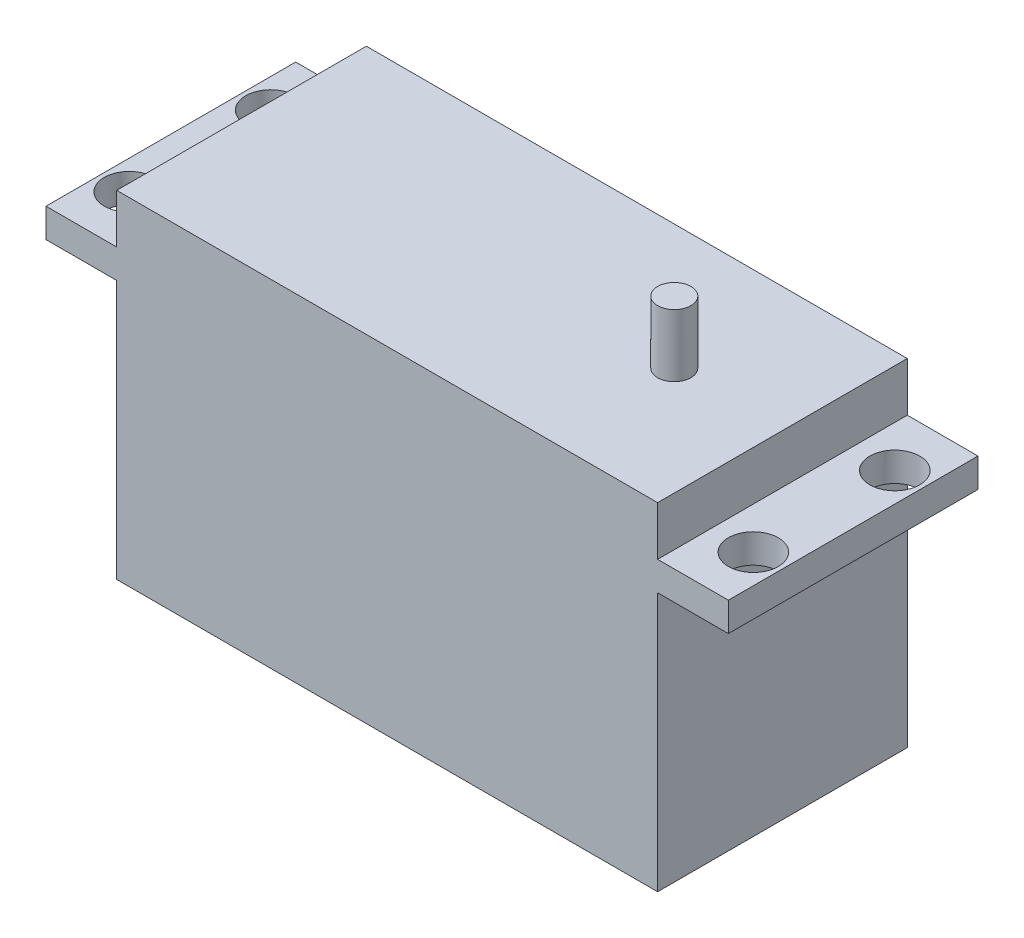
ISO-10303-21;
HEADER;
FILE_DESCRIPTION(('STEP AP214'),'2;1');
FILE_NAME('part.step','',(''),(''),'','','');
FILE_SCHEMA(('AUTOMOTIVE_DESIGN { 1 0 10303 214 1 1 1 1 }'));
ENDSEC;
DATA;
#1=APPLICATION_CONTEXT('core data for automotive mechanical design processes');
#2=APPLICATION_PROTOCOL_DEFINITION('international standard','automotive_design',2000,#1);
#3=PRODUCT_CONTEXT('',#1,'mechanical');
#4=PRODUCT('Part','Part','',(#3));
#5=PRODUCT_RELATED_PRODUCT_CATEGORY('part','',(#4));
#6=PRODUCT_DEFINITION_FORMATION('','',#4);
#7=PRODUCT_DEFINITION_CONTEXT('part definition',#1,'design');
#8=PRODUCT_DEFINITION('design','',#6,#7);
#9=PRODUCT_DEFINITION_SHAPE('','',#8);
#10=(LENGTH_UNIT() NAMED_UNIT(*) SI_UNIT(.MILLI.,.METRE.));
#11=(NAMED_UNIT(*) PLANE_ANGLE_UNIT() SI_UNIT($,.RADIAN.));
#12=(NAMED_UNIT(*) SI_UNIT($,.STERADIAN.) SOLID_ANGLE_UNIT());
#13=UNCERTAINTY_MEASURE_WITH_UNIT(LENGTH_MEASURE(1.E-05),#10,'distance_accuracy_value','');
#14=(GEOMETRIC_REPRESENTATION_CONTEXT(3) GLOBAL_UNCERTAINTY_ASSIGNED_CONTEXT((#13)) GLOBAL_UNIT_ASSIGNED_CONTEXT((#10,
#11,#12)) REPRESENTATION_CONTEXT('',''));
#15=CARTESIAN_POINT('',(0.,0.,0.));
#16=DIRECTION('',(0.,0.,1.));
#17=DIRECTION('',(1.,0.,0.));
#18=AXIS2_PLACEMENT_3D('',#15,#16,#17);
#19=CARTESIAN_POINT('',(0.,40.5,0.));
#20=DIRECTION('',(1.,0.,0.));
#21=DIRECTION('',(0.,0.,-1.));
#22=AXIS2_PLACEMENT_3D('',#19,#20,#21);
#23=PLANE('',#22);
#24=DIRECTION('',(0.,-1.,0.));
#25=VECTOR('',#24,1.);
#26=CARTESIAN_POINT('',(0.,40.5,-30.));
#27=LINE('',#26,#25);
#28=CARTESIAN_POINT('',(0.,40.5,-30.));
#29=VERTEX_POINT('',#28);
#30=CARTESIAN_POINT('',(0.,34.6,-30.));
#31=VERTEX_POINT('',#30);
#32=EDGE_CURVE('E207',#29,#31,#27,.T.);
#33=ORIENTED_EDGE('',*,*,#32,.T.);
#34=DIRECTION('',(0.,0.,1.));
#35=VECTOR('',#34,1.);
#36=CARTESIAN_POINT('',(0.,34.6,0.));
#37=LINE('',#36,#35);
#38=CARTESIAN_POINT('',(0.,34.6,0.));
#39=VERTEX_POINT('',#38);
#40=EDGE_CURVE('E183',#31,#39,#37,.T.);
#41=ORIENTED_EDGE('',*,*,#40,.T.);
#42=DIRECTION('',(0.,-1.,0.));
#43=VECTOR('',#42,1.);
#44=CARTESIAN_POINT('',(0.,40.5,0.));
#45=LINE('',#44,#43);
#46=CARTESIAN_POINT('',(0.,40.5,0.));
#47=VERTEX_POINT('',#46);
#48=EDGE_CURVE('E44',#47,#39,#45,.T.);
#49=ORIENTED_EDGE('',*,*,#48,.F.);
#50=DIRECTION('',(0.,0.,1.));
#51=VECTOR('',#50,1.);
#52=CARTESIAN_POINT('',(0.,40.5,0.));
#53=LINE('',#52,#51);
#54=EDGE_CURVE('E187',#29,#47,#53,.T.);
#55=ORIENTED_EDGE('',*,*,#54,.F.);
#56=EDGE_LOOP('',(#33,#41,#49,#55));
#57=FACE_BOUND('',#56,.T.);
#58=ADVANCED_FACE('F36',(#57),#23,.F.);
#59=CARTESIAN_POINT('',(65.,40.5,0.));
#60=DIRECTION('',(-1.,0.,0.));
#61=DIRECTION('',(0.,0.,1.));
#62=AXIS2_PLACEMENT_3D('',#59,#60,#61);
#63=PLANE('',#62);
#64=DIRECTION('',(0.,-1.,0.));
#65=VECTOR('',#64,1.);
#66=CARTESIAN_POINT('',(65.,40.5,0.));
#67=LINE('',#66,#65);
#68=CARTESIAN_POINT('',(65.,40.5,0.));
#69=VERTEX_POINT('',#68);
#70=CARTESIAN_POINT('',(65.,34.6,0.));
#71=VERTEX_POINT('',#70);
#72=EDGE_CURVE('E214',#69,#71,#67,.T.);
#73=ORIENTED_EDGE('',*,*,#72,.T.);
#74=DIRECTION('',(0.,0.,-1.));
#75=VECTOR('',#74,1.);
#76=CARTESIAN_POINT('',(65.,34.6,0.));
#77=LINE('',#76,#75);
#78=CARTESIAN_POINT('',(65.,34.6,-30.));
#79=VERTEX_POINT('',#78);
#80=EDGE_CURVE('E180',#71,#79,#77,.T.);
#81=ORIENTED_EDGE('',*,*,#80,.T.);
#82=DIRECTION('',(0.,-1.,0.));
#83=VECTOR('',#82,1.);
#84=CARTESIAN_POINT('',(65.,40.5,-30.));
#85=LINE('',#84,#83);
#86=CARTESIAN_POINT('',(65.,40.5,-30.));
#87=VERTEX_POINT('',#86);
#88=EDGE_CURVE('E211',#87,#79,#85,.T.);
#89=ORIENTED_EDGE('',*,*,#88,.F.);
#90=DIRECTION('',(0.,0.,-1.));
#91=VECTOR('',#90,1.);
#92=CARTESIAN_POINT('',(65.,40.5,0.));
#93=LINE('',#92,#91);
#94=EDGE_CURVE('E193',#69,#87,#93,.T.);
#95=ORIENTED_EDGE('',*,*,#94,.F.);
#96=EDGE_LOOP('',(#73,#81,#89,#95));
#97=FACE_BOUND('',#96,.T.);
#98=ADVANCED_FACE('F271',(#97),#63,.F.);
#99=CARTESIAN_POINT('',(0.,31.12,0.));
#100=VERTEX_POINT('',#99);
#101=CARTESIAN_POINT('',(0.,0.,0.));
#102=VERTEX_POINT('',#101);
#103=EDGE_CURVE('E217',#100,#102,#45,.T.);
#104=ORIENTED_EDGE('',*,*,#103,.F.);
#105=DIRECTION('',(0.,0.,-1.));
#106=VECTOR('',#105,1.);
#107=CARTESIAN_POINT('',(0.,31.12,0.));
#108=LINE('',#107,#106);
#109=CARTESIAN_POINT('',(0.,31.12,-30.));
#110=VERTEX_POINT('',#109);
#111=EDGE_CURVE('E178',#100,#110,#108,.T.);
#112=ORIENTED_EDGE('',*,*,#111,.T.);
#113=CARTESIAN_POINT('',(0.,0.,-30.));
#114=VERTEX_POINT('',#113);
#115=EDGE_CURVE('E197',#110,#114,#27,.T.);
#116=ORIENTED_EDGE('',*,*,#115,.T.);
#117=DIRECTION('',(0.,0.,1.));
#118=VECTOR('',#117,1.);
#119=CARTESIAN_POINT('',(0.,0.,0.));
#120=LINE('',#119,#118);
#121=EDGE_CURVE('E186',#114,#102,#120,.T.);
#122=ORIENTED_EDGE('',*,*,#121,.T.);
#123=EDGE_LOOP('',(#104,#112,#116,#122));
#124=FACE_BOUND('',#123,.T.);
#125=ADVANCED_FACE('F38',(#124),#23,.F.);
#126=CARTESIAN_POINT('',(0.,40.5,0.));
#127=DIRECTION('',(0.,0.,-1.));
#128=DIRECTION('',(-1.,0.,0.));
#129=AXIS2_PLACEMENT_3D('',#126,#127,#128);
#130=PLANE('',#129);
#131=CARTESIAN_POINT('',(65.,31.12,0.));
#132=VERTEX_POINT('',#131);
#133=CARTESIAN_POINT('',(65.,0.,0.));
#134=VERTEX_POINT('',#133);
#135=EDGE_CURVE('E130',#132,#134,#67,.T.);
#136=ORIENTED_EDGE('',*,*,#135,.F.);
#137=DIRECTION('',(1.,0.,0.));
#138=VECTOR('',#137,1.);
#139=CARTESIAN_POINT('',(-8.49999999999999,31.12,0.));
#140=LINE('',#139,#138);
#141=CARTESIAN_POINT('',(73.5,31.12,0.));
#142=VERTEX_POINT('',#141);
#143=EDGE_CURVE('E51',#132,#142,#140,.T.);
#144=ORIENTED_EDGE('',*,*,#143,.T.);
#145=DIRECTION('',(0.,-1.,0.));
#146=VECTOR('',#145,1.);
#147=CARTESIAN_POINT('',(73.5,31.12,0.));
#148=LINE('',#147,#146);
#149=CARTESIAN_POINT('',(73.5,34.6,0.));
#150=VERTEX_POINT('',#149);
#151=EDGE_CURVE('E128',#150,#142,#148,.T.);
#152=ORIENTED_EDGE('',*,*,#151,.F.);
#153=DIRECTION('',(1.,0.,0.));
#154=VECTOR('',#153,1.);
#155=CARTESIAN_POINT('',(-8.49999999999999,34.6,0.));
#156=LINE('',#155,#154);
#157=EDGE_CURVE('E170',#71,#150,#156,.T.);
#158=ORIENTED_EDGE('',*,*,#157,.F.);
#159=ORIENTED_EDGE('',*,*,#72,.F.);
#160=DIRECTION('',(1.,0.,0.));
#161=VECTOR('',#160,1.);
#162=CARTESIAN_POINT('',(0.,40.5,0.));
#163=LINE('',#162,#161);
#164=EDGE_CURVE('E190',#47,#69,#163,.T.);
#165=ORIENTED_EDGE('',*,*,#164,.F.);
#166=ORIENTED_EDGE('',*,*,#48,.T.);
#167=CARTESIAN_POINT('',(-8.49999999999999,34.6,0.));
#168=VERTEX_POINT('',#167);
#169=EDGE_CURVE('E167',#168,#39,#156,.T.);
#170=ORIENTED_EDGE('',*,*,#169,.F.);
#171=DIRECTION('',(0.,-1.,0.));
#172=VECTOR('',#171,1.);
#173=CARTESIAN_POINT('',(-8.49999999999999,31.12,0.));
#174=LINE('',#173,#172);
#175=CARTESIAN_POINT('',(-8.49999999999999,31.12,0.));
#176=VERTEX_POINT('',#175);
#177=EDGE_CURVE('E157',#168,#176,#174,.T.);
#178=ORIENTED_EDGE('',*,*,#177,.T.);
#179=EDGE_CURVE('E131',#176,#100,#140,.T.);
#180=ORIENTED_EDGE('',*,*,#179,.T.);
#181=ORIENTED_EDGE('',*,*,#103,.T.);
#182=DIRECTION('',(1.,0.,0.));
#183=VECTOR('',#182,1.);
#184=CARTESIAN_POINT('',(0.,0.,0.));
#185=LINE('',#184,#183);
#186=EDGE_CURVE('E200',#102,#134,#185,.T.);
#187=ORIENTED_EDGE('',*,*,#186,.T.);
#188=EDGE_LOOP('',(#136,#144,#152,#158,#159,#165,#166,#170,#178,#180,#181,#187));
#189=FACE_BOUND('',#188,.T.);
#190=ADVANCED_FACE('F125',(#189),#130,.F.);
#191=CARTESIAN_POINT('',(65.,31.12,-30.));
#192=VERTEX_POINT('',#191);
#193=CARTESIAN_POINT('',(65.,0.,-30.));
#194=VERTEX_POINT('',#193);
#195=EDGE_CURVE('E210',#192,#194,#85,.T.);
#196=ORIENTED_EDGE('',*,*,#195,.F.);
#197=DIRECTION('',(0.,0.,1.));
#198=VECTOR('',#197,1.);
#199=CARTESIAN_POINT('',(65.,31.12,0.));
#200=LINE('',#199,#198);
#201=EDGE_CURVE('E169',#192,#132,#200,.T.);
#202=ORIENTED_EDGE('',*,*,#201,.T.);
#203=ORIENTED_EDGE('',*,*,#135,.T.);
#204=DIRECTION('',(0.,0.,-1.));
#205=VECTOR('',#204,1.);
#206=CARTESIAN_POINT('',(65.,0.,0.));
#207=LINE('',#206,#205);
#208=EDGE_CURVE('E202',#134,#194,#207,.T.);
#209=ORIENTED_EDGE('',*,*,#208,.T.);
#210=EDGE_LOOP('',(#196,#202,#203,#209));
#211=FACE_BOUND('',#210,.T.);
#212=ADVANCED_FACE('F290',(#211),#63,.F.);
#213=CARTESIAN_POINT('',(0.,40.5,-30.));
#214=DIRECTION('',(0.,0.,1.));
#215=DIRECTION('',(1.,0.,0.));
#216=AXIS2_PLACEMENT_3D('',#213,#214,#215);
#217=PLANE('',#216);
#218=ORIENTED_EDGE('',*,*,#115,.F.);
#219=DIRECTION('',(1.,0.,0.));
#220=VECTOR('',#219,1.);
#221=CARTESIAN_POINT('',(-8.49999999999999,31.12,-30.));
#222=LINE('',#221,#220);
#223=CARTESIAN_POINT('',(-8.49999999999999,31.12,-30.));
#224=VERTEX_POINT('',#223);
#225=EDGE_CURVE('E59',#224,#110,#222,.T.);
#226=ORIENTED_EDGE('',*,*,#225,.F.);
#227=DIRECTION('',(0.,1.,0.));
#228=VECTOR('',#227,1.);
#229=CARTESIAN_POINT('',(-8.49999999999999,31.12,-30.));
#230=LINE('',#229,#228);
#231=CARTESIAN_POINT('',(-8.49999999999999,34.6,-30.));
#232=VERTEX_POINT('',#231);
#233=EDGE_CURVE('E162',#224,#232,#230,.T.);
#234=ORIENTED_EDGE('',*,*,#233,.T.);
#235=DIRECTION('',(1.,0.,0.));
#236=VECTOR('',#235,1.);
#237=CARTESIAN_POINT('',(-8.49999999999999,34.6,-30.));
#238=LINE('',#237,#236);
#239=EDGE_CURVE('E171',#232,#31,#238,.T.);
#240=ORIENTED_EDGE('',*,*,#239,.T.);
#241=ORIENTED_EDGE('',*,*,#32,.F.);
#242=DIRECTION('',(-1.,0.,0.));
#243=VECTOR('',#242,1.);
#244=CARTESIAN_POINT('',(0.,40.5,-30.));
#245=LINE('',#244,#243);
#246=EDGE_CURVE('E195',#87,#29,#245,.T.);
#247=ORIENTED_EDGE('',*,*,#246,.F.);
#248=ORIENTED_EDGE('',*,*,#88,.T.);
#249=CARTESIAN_POINT('',(73.5,34.6,-30.));
#250=VERTEX_POINT('',#249);
#251=EDGE_CURVE('E174',#79,#250,#238,.T.);
#252=ORIENTED_EDGE('',*,*,#251,.T.);
#253=DIRECTION('',(0.,1.,0.));
#254=VECTOR('',#253,1.);
#255=CARTESIAN_POINT('',(73.5,31.12,-30.));
#256=LINE('',#255,#254);
#257=CARTESIAN_POINT('',(73.5,31.12,-30.));
#258=VERTEX_POINT('',#257);
#259=EDGE_CURVE('E142',#258,#250,#256,.T.);
#260=ORIENTED_EDGE('',*,*,#259,.F.);
#261=EDGE_CURVE('E138',#192,#258,#222,.T.);
#262=ORIENTED_EDGE('',*,*,#261,.F.);
#263=ORIENTED_EDGE('',*,*,#195,.T.);
#264=DIRECTION('',(-1.,0.,0.));
#265=VECTOR('',#264,1.);
#266=CARTESIAN_POINT('',(0.,0.,-30.));
#267=LINE('',#266,#265);
#268=EDGE_CURVE('E191',#194,#114,#267,.T.);
#269=ORIENTED_EDGE('',*,*,#268,.T.);
#270=EDGE_LOOP('',(#218,#226,#234,#240,#241,#247,#248,#252,#260,#262,#263,#269));
#271=FACE_BOUND('',#270,.T.);
#272=ADVANCED_FACE('F259',(#271),#217,.F.);
#273=CARTESIAN_POINT('',(0.,40.5,0.));
#274=DIRECTION('',(0.,-1.,0.));
#275=DIRECTION('',(0.,0.,-1.));
#276=AXIS2_PLACEMENT_3D('',#273,#274,#275);
#277=PLANE('',#276);
#278=CARTESIAN_POINT('',(52.,40.5,-15.));
#279=DIRECTION('',(0.,-1.,0.));
#280=DIRECTION('',(0.,0.,-1.));
#281=AXIS2_PLACEMENT_3D('',#278,#279,#280);
#282=CIRCLE('',#281,2.);
#283=CARTESIAN_POINT('',(52.,40.5,-17.));
#284=VERTEX_POINT('',#283);
#285=EDGE_CURVE('E11',#284,#284,#282,.F.);
#286=ORIENTED_EDGE('',*,*,#285,.F.);
#287=EDGE_LOOP('',(#286));
#288=FACE_BOUND('',#287,.T.);
#289=ORIENTED_EDGE('',*,*,#54,.T.);
#290=ORIENTED_EDGE('',*,*,#164,.T.);
#291=ORIENTED_EDGE('',*,*,#94,.T.);
#292=ORIENTED_EDGE('',*,*,#246,.T.);
#293=EDGE_LOOP('',(#289,#290,#291,#292));
#294=FACE_BOUND('',#293,.T.);
#295=ADVANCED_FACE('F255',(#288,#294),#277,.F.);
#296=CARTESIAN_POINT('',(0.,0.,0.));
#297=DIRECTION('',(0.,-1.,0.));
#298=DIRECTION('',(0.,0.,-1.));
#299=AXIS2_PLACEMENT_3D('',#296,#297,#298);
#300=PLANE('',#299);
#301=ORIENTED_EDGE('',*,*,#121,.F.);
#302=ORIENTED_EDGE('',*,*,#268,.F.);
#303=ORIENTED_EDGE('',*,*,#208,.F.);
#304=ORIENTED_EDGE('',*,*,#186,.F.);
#305=EDGE_LOOP('',(#301,#302,#303,#304));
#306=FACE_BOUND('',#305,.T.);
#307=ADVANCED_FACE('F258',(#306),#300,.T.);
#308=CARTESIAN_POINT('',(73.5,0.,0.));
#309=DIRECTION('',(-1.,0.,0.));
#310=DIRECTION('',(0.,0.,1.));
#311=AXIS2_PLACEMENT_3D('',#308,#309,#310);
#312=PLANE('',#311);
#313=ORIENTED_EDGE('',*,*,#151,.T.);
#314=DIRECTION('',(0.,0.,-1.));
#315=VECTOR('',#314,1.);
#316=CARTESIAN_POINT('',(73.5,31.12,0.));
#317=LINE('',#316,#315);
#318=EDGE_CURVE('E135',#142,#258,#317,.T.);
#319=ORIENTED_EDGE('',*,*,#318,.T.);
#320=ORIENTED_EDGE('',*,*,#259,.T.);
#321=DIRECTION('',(0.,0.,1.));
#322=VECTOR('',#321,1.);
#323=CARTESIAN_POINT('',(73.5,34.6,0.));
#324=LINE('',#323,#322);
#325=EDGE_CURVE('E147',#250,#150,#324,.T.);
#326=ORIENTED_EDGE('',*,*,#325,.T.);
#327=EDGE_LOOP('',(#313,#319,#320,#326));
#328=FACE_BOUND('',#327,.T.);
#329=ADVANCED_FACE('F145',(#328),#312,.F.);
#330=CARTESIAN_POINT('',(-8.49999999999999,31.12,0.));
#331=DIRECTION('',(0.,-1.,0.));
#332=DIRECTION('',(0.,0.,-1.));
#333=AXIS2_PLACEMENT_3D('',#330,#331,#332);
#334=PLANE('',#333);
#335=CARTESIAN_POINT('',(70.,31.12,-6.5));
#336=DIRECTION('',(0.,-1.,0.));
#337=DIRECTION('',(0.,0.,-1.));
#338=AXIS2_PLACEMENT_3D('',#335,#336,#337);
#339=CIRCLE('',#338,3.00000000000001);
#340=CARTESIAN_POINT('',(70.,31.12,-9.50000000000001));
#341=VERTEX_POINT('',#340);
#342=EDGE_CURVE('E148',#341,#341,#339,.T.);
#343=ORIENTED_EDGE('',*,*,#342,.F.);
#344=EDGE_LOOP('',(#343));
#345=FACE_BOUND('',#344,.T.);
#346=CARTESIAN_POINT('',(70.,31.12,-23.5));
#347=DIRECTION('',(0.,-1.,0.));
#348=DIRECTION('',(0.,0.,-1.));
#349=AXIS2_PLACEMENT_3D('',#346,#347,#348);
#350=CIRCLE('',#349,3.00000000000001);
#351=CARTESIAN_POINT('',(70.,31.12,-26.5));
#352=VERTEX_POINT('',#351);
#353=EDGE_CURVE('E151',#352,#352,#350,.T.);
#354=ORIENTED_EDGE('',*,*,#353,.F.);
#355=EDGE_LOOP('',(#354));
#356=FACE_BOUND('',#355,.T.);
#357=ORIENTED_EDGE('',*,*,#201,.F.);
#358=ORIENTED_EDGE('',*,*,#261,.T.);
#359=ORIENTED_EDGE('',*,*,#318,.F.);
#360=ORIENTED_EDGE('',*,*,#143,.F.);
#361=EDGE_LOOP('',(#357,#358,#359,#360));
#362=FACE_BOUND('',#361,.T.);
#363=ADVANCED_FACE('F136',(#345,#356,#362),#334,.T.);
#364=CARTESIAN_POINT('',(-8.49999999999999,34.6,0.));
#365=DIRECTION('',(0.,1.,0.));
#366=DIRECTION('',(0.,0.,1.));
#367=AXIS2_PLACEMENT_3D('',#364,#365,#366);
#368=PLANE('',#367);
#369=CARTESIAN_POINT('',(70.,34.6,-6.5));
#370=DIRECTION('',(0.,1.,0.));
#371=DIRECTION('',(0.,0.,1.));
#372=AXIS2_PLACEMENT_3D('',#369,#370,#371);
#373=CIRCLE('',#372,3.00000000000001);
#374=CARTESIAN_POINT('',(70.,34.6,-3.49999999999999));
#375=VERTEX_POINT('',#374);
#376=EDGE_CURVE('E233',#375,#375,#373,.T.);
#377=ORIENTED_EDGE('',*,*,#376,.F.);
#378=EDGE_LOOP('',(#377));
#379=FACE_BOUND('',#378,.T.);
#380=CARTESIAN_POINT('',(70.,34.6,-23.5));
#381=DIRECTION('',(0.,1.,0.));
#382=DIRECTION('',(0.,0.,1.));
#383=AXIS2_PLACEMENT_3D('',#380,#381,#382);
#384=CIRCLE('',#383,3.00000000000001);
#385=CARTESIAN_POINT('',(70.,34.6,-20.5));
#386=VERTEX_POINT('',#385);
#387=EDGE_CURVE('E223',#386,#386,#384,.T.);
#388=ORIENTED_EDGE('',*,*,#387,.F.);
#389=EDGE_LOOP('',(#388));
#390=FACE_BOUND('',#389,.T.);
#391=ORIENTED_EDGE('',*,*,#80,.F.);
#392=ORIENTED_EDGE('',*,*,#157,.T.);
#393=ORIENTED_EDGE('',*,*,#325,.F.);
#394=ORIENTED_EDGE('',*,*,#251,.F.);
#395=EDGE_LOOP('',(#391,#392,#393,#394));
#396=FACE_BOUND('',#395,.T.);
#397=ADVANCED_FACE('F292',(#379,#390,#396),#368,.T.);
#398=CARTESIAN_POINT('',(-5.,34.6,-23.5));
#399=DIRECTION('',(0.,1.,0.));
#400=DIRECTION('',(0.,0.,1.));
#401=AXIS2_PLACEMENT_3D('',#398,#399,#400);
#402=CIRCLE('',#401,3.);
#403=CARTESIAN_POINT('',(-5.,34.6,-20.5));
#404=VERTEX_POINT('',#403);
#405=EDGE_CURVE('E234',#404,#404,#402,.T.);
#406=ORIENTED_EDGE('',*,*,#405,.F.);
#407=EDGE_LOOP('',(#406));
#408=FACE_BOUND('',#407,.T.);
#409=CARTESIAN_POINT('',(-5.,34.6,-6.5));
#410=DIRECTION('',(0.,1.,0.));
#411=DIRECTION('',(0.,0.,1.));
#412=AXIS2_PLACEMENT_3D('',#409,#410,#411);
#413=CIRCLE('',#412,3.);
#414=CARTESIAN_POINT('',(-5.,34.6,-3.5));
#415=VERTEX_POINT('',#414);
#416=EDGE_CURVE('E237',#415,#415,#413,.T.);
#417=ORIENTED_EDGE('',*,*,#416,.F.);
#418=EDGE_LOOP('',(#417));
#419=FACE_BOUND('',#418,.T.);
#420=ORIENTED_EDGE('',*,*,#40,.F.);
#421=ORIENTED_EDGE('',*,*,#239,.F.);
#422=DIRECTION('',(0.,0.,1.));
#423=VECTOR('',#422,1.);
#424=CARTESIAN_POINT('',(-8.49999999999999,34.6,0.));
#425=LINE('',#424,#423);
#426=EDGE_CURVE('E132',#232,#168,#425,.T.);
#427=ORIENTED_EDGE('',*,*,#426,.T.);
#428=ORIENTED_EDGE('',*,*,#169,.T.);
#429=EDGE_LOOP('',(#420,#421,#427,#428));
#430=FACE_BOUND('',#429,.T.);
#431=ADVANCED_FACE('F277',(#408,#419,#430),#368,.T.);
#432=CARTESIAN_POINT('',(-5.,31.12,-23.5));
#433=DIRECTION('',(0.,-1.,0.));
#434=DIRECTION('',(0.,0.,-1.));
#435=AXIS2_PLACEMENT_3D('',#432,#433,#434);
#436=CIRCLE('',#435,3.);
#437=CARTESIAN_POINT('',(-5.,31.12,-26.5));
#438=VERTEX_POINT('',#437);
#439=EDGE_CURVE('E222',#438,#438,#436,.T.);
#440=ORIENTED_EDGE('',*,*,#439,.F.);
#441=EDGE_LOOP('',(#440));
#442=FACE_BOUND('',#441,.T.);
#443=CARTESIAN_POINT('',(-5.,31.12,-6.5));
#444=DIRECTION('',(0.,-1.,0.));
#445=DIRECTION('',(0.,0.,-1.));
#446=AXIS2_PLACEMENT_3D('',#443,#444,#445);
#447=CIRCLE('',#446,3.);
#448=CARTESIAN_POINT('',(-5.,31.12,-9.5));
#449=VERTEX_POINT('',#448);
#450=EDGE_CURVE('E220',#449,#449,#447,.T.);
#451=ORIENTED_EDGE('',*,*,#450,.F.);
#452=EDGE_LOOP('',(#451));
#453=FACE_BOUND('',#452,.T.);
#454=ORIENTED_EDGE('',*,*,#111,.F.);
#455=ORIENTED_EDGE('',*,*,#179,.F.);
#456=DIRECTION('',(0.,0.,-1.));
#457=VECTOR('',#456,1.);
#458=CARTESIAN_POINT('',(-8.49999999999999,31.12,0.));
#459=LINE('',#458,#457);
#460=EDGE_CURVE('E160',#176,#224,#459,.T.);
#461=ORIENTED_EDGE('',*,*,#460,.T.);
#462=ORIENTED_EDGE('',*,*,#225,.T.);
#463=EDGE_LOOP('',(#454,#455,#461,#462));
#464=FACE_BOUND('',#463,.T.);
#465=ADVANCED_FACE('F300',(#442,#453,#464),#334,.T.);
#466=CARTESIAN_POINT('',(-8.49999999999999,0.,0.));
#467=DIRECTION('',(-1.,0.,0.));
#468=DIRECTION('',(0.,0.,1.));
#469=AXIS2_PLACEMENT_3D('',#466,#467,#468);
#470=PLANE('',#469);
#471=ORIENTED_EDGE('',*,*,#177,.F.);
#472=ORIENTED_EDGE('',*,*,#426,.F.);
#473=ORIENTED_EDGE('',*,*,#233,.F.);
#474=ORIENTED_EDGE('',*,*,#460,.F.);
#475=EDGE_LOOP('',(#471,#472,#473,#474));
#476=FACE_BOUND('',#475,.T.);
#477=ADVANCED_FACE('F279',(#476),#470,.T.);
#478=CARTESIAN_POINT('',(-5.,0.,-6.5));
#479=DIRECTION('',(0.,1.,0.));
#480=DIRECTION('',(0.,0.,1.));
#481=AXIS2_PLACEMENT_3D('',#478,#479,#480);
#482=CYLINDRICAL_SURFACE('',#481,3.);
#483=ORIENTED_EDGE('',*,*,#450,.T.);
#484=EDGE_LOOP('',(#483));
#485=FACE_BOUND('',#484,.T.);
#486=ORIENTED_EDGE('',*,*,#416,.T.);
#487=EDGE_LOOP('',(#486));
#488=FACE_BOUND('',#487,.T.);
#489=ADVANCED_FACE('F328',(#485,#488),#482,.F.);
#490=CARTESIAN_POINT('',(-5.,0.,-23.5));
#491=DIRECTION('',(0.,1.,0.));
#492=DIRECTION('',(0.,0.,1.));
#493=AXIS2_PLACEMENT_3D('',#490,#491,#492);
#494=CYLINDRICAL_SURFACE('',#493,3.);
#495=ORIENTED_EDGE('',*,*,#439,.T.);
#496=EDGE_LOOP('',(#495));
#497=FACE_BOUND('',#496,.T.);
#498=ORIENTED_EDGE('',*,*,#405,.T.);
#499=EDGE_LOOP('',(#498));
#500=FACE_BOUND('',#499,.T.);
#501=ADVANCED_FACE('F334',(#497,#500),#494,.F.);
#502=CARTESIAN_POINT('',(70.,0.,-23.5));
#503=DIRECTION('',(0.,1.,0.));
#504=DIRECTION('',(0.,0.,1.));
#505=AXIS2_PLACEMENT_3D('',#502,#503,#504);
#506=CYLINDRICAL_SURFACE('',#505,3.00000000000001);
#507=ORIENTED_EDGE('',*,*,#353,.T.);
#508=EDGE_LOOP('',(#507));
#509=FACE_BOUND('',#508,.T.);
#510=ORIENTED_EDGE('',*,*,#387,.T.);
#511=EDGE_LOOP('',(#510));
#512=FACE_BOUND('',#511,.T.);
#513=ADVANCED_FACE('F341',(#509,#512),#506,.F.);
#514=CARTESIAN_POINT('',(70.,0.,-6.5));
#515=DIRECTION('',(0.,1.,0.));
#516=DIRECTION('',(0.,0.,1.));
#517=AXIS2_PLACEMENT_3D('',#514,#515,#516);
#518=CYLINDRICAL_SURFACE('',#517,3.00000000000001);
#519=ORIENTED_EDGE('',*,*,#342,.T.);
#520=EDGE_LOOP('',(#519));
#521=FACE_BOUND('',#520,.T.);
#522=ORIENTED_EDGE('',*,*,#376,.T.);
#523=EDGE_LOOP('',(#522));
#524=FACE_BOUND('',#523,.T.);
#525=ADVANCED_FACE('F251',(#521,#524),#518,.F.);
#526=CARTESIAN_POINT('',(52.,48.,-15.));
#527=DIRECTION('',(0.,-1.,0.));
#528=DIRECTION('',(0.,0.,-1.));
#529=AXIS2_PLACEMENT_3D('',#526,#527,#528);
#530=CYLINDRICAL_SURFACE('',#529,2.);
#531=CARTESIAN_POINT('',(52.,48.,-15.));
#532=DIRECTION('',(0.,1.,0.));
#533=DIRECTION('',(0.,0.,1.));
#534=AXIS2_PLACEMENT_3D('',#531,#532,#533);
#535=CIRCLE('',#534,2.);
#536=CARTESIAN_POINT('',(52.,48.,-13.));
#537=VERTEX_POINT('',#536);
#538=EDGE_CURVE('E242',#537,#537,#535,.T.);
#539=ORIENTED_EDGE('',*,*,#538,.F.);
#540=EDGE_LOOP('',(#539));
#541=FACE_BOUND('',#540,.T.);
#542=ORIENTED_EDGE('',*,*,#285,.T.);
#543=EDGE_LOOP('',(#542));
#544=FACE_BOUND('',#543,.T.);
#545=ADVANCED_FACE('F248',(#541,#544),#530,.T.);
#546=CARTESIAN_POINT('',(52.,48.,-15.));
#547=DIRECTION('',(0.,1.,0.));
#548=DIRECTION('',(0.,0.,1.));
#549=AXIS2_PLACEMENT_3D('',#546,#547,#548);
#550=PLANE('',#549);
#551=ORIENTED_EDGE('',*,*,#538,.T.);
#552=EDGE_LOOP('',(#551));
#553=FACE_BOUND('',#552,.T.);
#554=ADVANCED_FACE('F246',(#553),#550,.T.);
#555=CLOSED_SHELL('',(#58,#98,#125,#190,#212,#272,#295,#307,#329,#363,#397,#431,#465,#477,#489,
#501,#513,#525,#545,#554));
#556=MANIFOLD_SOLID_BREP('B2',#555);
#557=ADVANCED_BREP_SHAPE_REPRESENTATION('',(#18,#556),#14);
#558=SHAPE_DEFINITION_REPRESENTATION(#9,#557);
ENDSEC;
END-ISO-10303-21;
